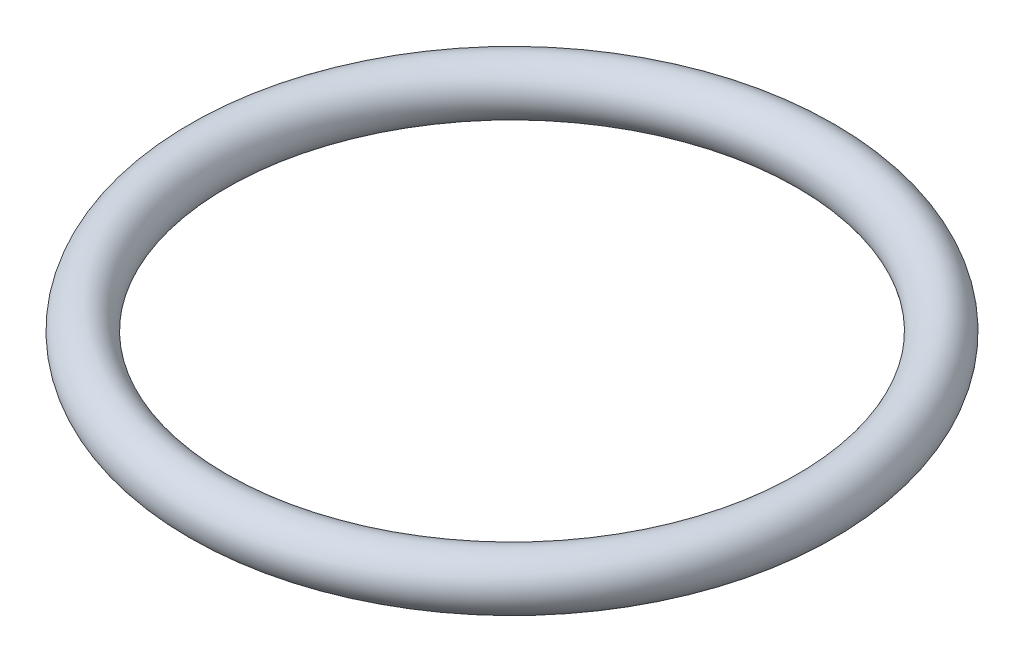
ISO-10303-21;
HEADER;
FILE_DESCRIPTION(('STEP AP214'),'2;1');
FILE_NAME('part.step','',(''),(''),'','','');
FILE_SCHEMA(('AUTOMOTIVE_DESIGN { 1 0 10303 214 1 1 1 1 }'));
ENDSEC;
DATA;
#1=APPLICATION_CONTEXT('core data for automotive mechanical design processes');
#2=APPLICATION_PROTOCOL_DEFINITION('international standard','automotive_design',2000,#1);
#3=PRODUCT_CONTEXT('',#1,'mechanical');
#4=PRODUCT('Part','Part','',(#3));
#5=PRODUCT_RELATED_PRODUCT_CATEGORY('part','',(#4));
#6=PRODUCT_DEFINITION_FORMATION('','',#4);
#7=PRODUCT_DEFINITION_CONTEXT('part definition',#1,'design');
#8=PRODUCT_DEFINITION('design','',#6,#7);
#9=PRODUCT_DEFINITION_SHAPE('','',#8);
#10=(LENGTH_UNIT() NAMED_UNIT(*) SI_UNIT(.MILLI.,.METRE.));
#11=(NAMED_UNIT(*) PLANE_ANGLE_UNIT() SI_UNIT($,.RADIAN.));
#12=(NAMED_UNIT(*) SI_UNIT($,.STERADIAN.) SOLID_ANGLE_UNIT());
#13=UNCERTAINTY_MEASURE_WITH_UNIT(LENGTH_MEASURE(1.E-05),#10,'distance_accuracy_value','');
#14=(GEOMETRIC_REPRESENTATION_CONTEXT(3) GLOBAL_UNCERTAINTY_ASSIGNED_CONTEXT((#13)) GLOBAL_UNIT_ASSIGNED_CONTEXT((#10,
#11,#12)) REPRESENTATION_CONTEXT('',''));
#15=CARTESIAN_POINT('',(0.,0.,0.));
#16=DIRECTION('',(0.,0.,1.));
#17=DIRECTION('',(1.,0.,0.));
#18=AXIS2_PLACEMENT_3D('',#15,#16,#17);
#19=CARTESIAN_POINT('',(0.,0.,0.));
#20=DIRECTION('',(0.,-1.,0.));
#21=DIRECTION('',(0.,0.,-1.));
#22=AXIS2_PLACEMENT_3D('',#19,#20,#21);
#23=TOROIDAL_SURFACE('',#22,27.78125,2.38125);
#24=CARTESIAN_POINT('',(0.,0.,-30.1625));
#25=VERTEX_POINT('',#24);
#26=VERTEX_LOOP('',#25);
#27=FACE_BOUND('',#26,.T.);
#28=ADVANCED_FACE('F33',(#27),#23,.T.);
#29=CLOSED_SHELL('',(#28));
#30=MANIFOLD_SOLID_BREP('B2',#29);
#31=ADVANCED_BREP_SHAPE_REPRESENTATION('',(#18,#30),#14);
#32=SHAPE_DEFINITION_REPRESENTATION(#9,#31);
ENDSEC;
END-ISO-10303-21;
